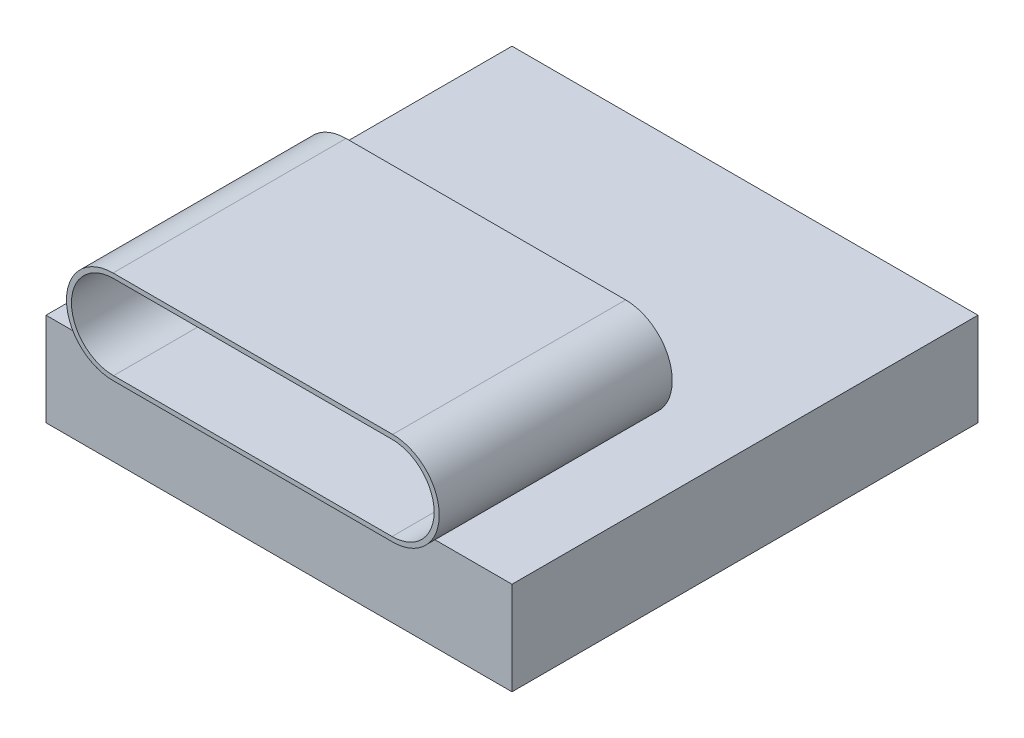
ISO-10303-21;
HEADER;
FILE_DESCRIPTION(('STEP AP214'),'2;1');
FILE_NAME('part.step','',(''),(''),'','','');
FILE_SCHEMA(('AUTOMOTIVE_DESIGN { 1 0 10303 214 1 1 1 1 }'));
ENDSEC;
DATA;
#1=APPLICATION_CONTEXT('core data for automotive mechanical design processes');
#2=APPLICATION_PROTOCOL_DEFINITION('international standard','automotive_design',2000,#1);
#3=PRODUCT_CONTEXT('',#1,'mechanical');
#4=PRODUCT('Part','Part','',(#3));
#5=PRODUCT_RELATED_PRODUCT_CATEGORY('part','',(#4));
#6=PRODUCT_DEFINITION_FORMATION('','',#4);
#7=PRODUCT_DEFINITION_CONTEXT('part definition',#1,'design');
#8=PRODUCT_DEFINITION('design','',#6,#7);
#9=PRODUCT_DEFINITION_SHAPE('','',#8);
#10=(LENGTH_UNIT() NAMED_UNIT(*) SI_UNIT(.MILLI.,.METRE.));
#11=(NAMED_UNIT(*) PLANE_ANGLE_UNIT() SI_UNIT($,.RADIAN.));
#12=(NAMED_UNIT(*) SI_UNIT($,.STERADIAN.) SOLID_ANGLE_UNIT());
#13=UNCERTAINTY_MEASURE_WITH_UNIT(LENGTH_MEASURE(1.E-05),#10,'distance_accuracy_value','');
#14=(GEOMETRIC_REPRESENTATION_CONTEXT(3) GLOBAL_UNCERTAINTY_ASSIGNED_CONTEXT((#13)) GLOBAL_UNIT_ASSIGNED_CONTEXT((#10,
#11,#12)) REPRESENTATION_CONTEXT('',''));
#15=CARTESIAN_POINT('',(0.,0.,0.));
#16=DIRECTION('',(0.,0.,1.));
#17=DIRECTION('',(1.,0.,0.));
#18=AXIS2_PLACEMENT_3D('',#15,#16,#17);
#19=CARTESIAN_POINT('',(-3.06110867908621,4.00403716134053,5.));
#20=DIRECTION('',(0.,1.,0.));
#21=DIRECTION('',(0.,0.,1.));
#22=AXIS2_PLACEMENT_3D('',#19,#20,#21);
#23=PLANE('',#22);
#24=DIRECTION('',(1.,0.,0.));
#25=VECTOR('',#24,1.);
#26=CARTESIAN_POINT('',(-3.06110867908621,4.00403716134053,0.));
#27=LINE('',#26,#25);
#28=CARTESIAN_POINT('',(-3.06110867908621,4.00403716134053,0.));
#29=VERTEX_POINT('',#28);
#30=CARTESIAN_POINT('',(2.93889132091379,4.00403716134053,0.));
#31=VERTEX_POINT('',#30);
#32=EDGE_CURVE('E139',#29,#31,#27,.T.);
#33=ORIENTED_EDGE('',*,*,#32,.F.);
#34=DIRECTION('',(0.,0.,-1.));
#35=VECTOR('',#34,1.);
#36=CARTESIAN_POINT('',(-3.06110867908621,4.00403716134053,5.));
#37=LINE('',#36,#35);
#38=CARTESIAN_POINT('',(-3.06110867908621,4.00403716134053,5.));
#39=VERTEX_POINT('',#38);
#40=EDGE_CURVE('E161',#39,#29,#37,.T.);
#41=ORIENTED_EDGE('',*,*,#40,.F.);
#42=DIRECTION('',(1.,0.,0.));
#43=VECTOR('',#42,1.);
#44=CARTESIAN_POINT('',(-3.06110867908621,4.00403716134053,5.));
#45=LINE('',#44,#43);
#46=CARTESIAN_POINT('',(2.93889132091379,4.00403716134053,5.));
#47=VERTEX_POINT('',#46);
#48=EDGE_CURVE('E142',#39,#47,#45,.T.);
#49=ORIENTED_EDGE('',*,*,#48,.T.);
#50=DIRECTION('',(0.,0.,-1.));
#51=VECTOR('',#50,1.);
#52=CARTESIAN_POINT('',(2.93889132091379,4.00403716134053,5.));
#53=LINE('',#52,#51);
#54=EDGE_CURVE('E152',#47,#31,#53,.T.);
#55=ORIENTED_EDGE('',*,*,#54,.T.);
#56=EDGE_LOOP('',(#33,#41,#49,#55));
#57=FACE_BOUND('',#56,.T.);
#58=ADVANCED_FACE('F49',(#57),#23,.T.);
#59=CARTESIAN_POINT('',(-3.06110867908621,3.00403716134053,5.));
#60=DIRECTION('',(0.,0.,-1.));
#61=DIRECTION('',(-1.,0.,0.));
#62=AXIS2_PLACEMENT_3D('',#59,#60,#61);
#63=CYLINDRICAL_SURFACE('',#62,1.);
#64=CARTESIAN_POINT('',(-3.06110867908621,3.00403716134053,0.));
#65=DIRECTION('',(0.,0.,1.));
#66=DIRECTION('',(1.,0.,0.));
#67=AXIS2_PLACEMENT_3D('',#64,#65,#66);
#68=CIRCLE('',#67,1.);
#69=CARTESIAN_POINT('',(-3.06110867908621,2.00403716134053,0.));
#70=VERTEX_POINT('',#69);
#71=EDGE_CURVE('E146',#29,#70,#68,.T.);
#72=ORIENTED_EDGE('',*,*,#71,.T.);
#73=DIRECTION('',(0.,0.,-1.));
#74=VECTOR('',#73,1.);
#75=CARTESIAN_POINT('',(-3.06110867908621,2.00403716134053,5.));
#76=LINE('',#75,#74);
#77=CARTESIAN_POINT('',(-3.06110867908621,2.00403716134053,5.));
#78=VERTEX_POINT('',#77);
#79=EDGE_CURVE('E164',#78,#70,#76,.T.);
#80=ORIENTED_EDGE('',*,*,#79,.F.);
#81=CARTESIAN_POINT('',(-3.06110867908621,3.00403716134053,5.));
#82=DIRECTION('',(0.,0.,1.));
#83=DIRECTION('',(1.,0.,0.));
#84=AXIS2_PLACEMENT_3D('',#81,#82,#83);
#85=CIRCLE('',#84,1.);
#86=EDGE_CURVE('E150',#39,#78,#85,.T.);
#87=ORIENTED_EDGE('',*,*,#86,.F.);
#88=ORIENTED_EDGE('',*,*,#40,.T.);
#89=EDGE_LOOP('',(#72,#80,#87,#88));
#90=FACE_BOUND('',#89,.T.);
#91=ADVANCED_FACE('F191',(#90),#63,.T.);
#92=CARTESIAN_POINT('',(-3.06110867908621,2.00403716134053,5.));
#93=DIRECTION('',(0.,1.,0.));
#94=DIRECTION('',(0.,0.,1.));
#95=AXIS2_PLACEMENT_3D('',#92,#93,#94);
#96=PLANE('',#95);
#97=DIRECTION('',(1.,0.,0.));
#98=VECTOR('',#97,1.);
#99=CARTESIAN_POINT('',(-3.06110867908621,2.00403716134053,0.));
#100=LINE('',#99,#98);
#101=CARTESIAN_POINT('',(2.93889132091379,2.00403716134053,0.));
#102=VERTEX_POINT('',#101);
#103=EDGE_CURVE('E158',#70,#102,#100,.T.);
#104=ORIENTED_EDGE('',*,*,#103,.T.);
#105=DIRECTION('',(0.,0.,-1.));
#106=VECTOR('',#105,1.);
#107=CARTESIAN_POINT('',(2.93889132091379,2.00403716134053,5.));
#108=LINE('',#107,#106);
#109=CARTESIAN_POINT('',(2.93889132091379,2.00403716134053,5.));
#110=VERTEX_POINT('',#109);
#111=EDGE_CURVE('E167',#110,#102,#108,.T.);
#112=ORIENTED_EDGE('',*,*,#111,.F.);
#113=DIRECTION('',(1.,0.,0.));
#114=VECTOR('',#113,1.);
#115=CARTESIAN_POINT('',(-3.06110867908621,2.00403716134053,5.));
#116=LINE('',#115,#114);
#117=EDGE_CURVE('E148',#78,#110,#116,.T.);
#118=ORIENTED_EDGE('',*,*,#117,.F.);
#119=ORIENTED_EDGE('',*,*,#79,.T.);
#120=EDGE_LOOP('',(#104,#112,#118,#119));
#121=FACE_BOUND('',#120,.T.);
#122=ADVANCED_FACE('F196',(#121),#96,.F.);
#123=CARTESIAN_POINT('',(2.93889132091379,3.00403716134053,5.));
#124=DIRECTION('',(0.,0.,-1.));
#125=DIRECTION('',(-1.,0.,0.));
#126=AXIS2_PLACEMENT_3D('',#123,#124,#125);
#127=CYLINDRICAL_SURFACE('',#126,1.);
#128=CARTESIAN_POINT('',(2.93889132091379,3.00403716134053,0.));
#129=DIRECTION('',(0.,0.,1.));
#130=DIRECTION('',(1.,0.,0.));
#131=AXIS2_PLACEMENT_3D('',#128,#129,#130);
#132=CIRCLE('',#131,1.);
#133=EDGE_CURVE('E155',#102,#31,#132,.T.);
#134=ORIENTED_EDGE('',*,*,#133,.T.);
#135=ORIENTED_EDGE('',*,*,#54,.F.);
#136=CARTESIAN_POINT('',(2.93889132091379,3.00403716134053,5.));
#137=DIRECTION('',(0.,0.,1.));
#138=DIRECTION('',(1.,0.,0.));
#139=AXIS2_PLACEMENT_3D('',#136,#137,#138);
#140=CIRCLE('',#139,1.);
#141=EDGE_CURVE('E145',#110,#47,#140,.T.);
#142=ORIENTED_EDGE('',*,*,#141,.F.);
#143=ORIENTED_EDGE('',*,*,#111,.T.);
#144=EDGE_LOOP('',(#134,#135,#142,#143));
#145=FACE_BOUND('',#144,.T.);
#146=ADVANCED_FACE('F212',(#145),#127,.T.);
#147=CARTESIAN_POINT('',(2.93889132091379,3.00403716134053,5.));
#148=DIRECTION('',(0.,0.,1.));
#149=DIRECTION('',(1.,0.,0.));
#150=AXIS2_PLACEMENT_3D('',#147,#148,#149);
#151=PLANE('',#150);
#152=CARTESIAN_POINT('',(-3.05073203949609,3.00336430111715,5.));
#153=DIRECTION('',(0.,0.,1.));
#154=DIRECTION('',(1.,0.,0.));
#155=AXIS2_PLACEMENT_3D('',#152,#153,#154);
#156=CIRCLE('',#155,0.902767644340679);
#157=CARTESIAN_POINT('',(-3.05073203949609,3.90613194545782,5.));
#158=VERTEX_POINT('',#157);
#159=CARTESIAN_POINT('',(-3.05073203949609,2.10059665677647,5.));
#160=VERTEX_POINT('',#159);
#161=EDGE_CURVE('E63',#158,#160,#156,.T.);
#162=ORIENTED_EDGE('',*,*,#161,.F.);
#163=DIRECTION('',(-1.,0.,0.));
#164=VECTOR('',#163,1.);
#165=CARTESIAN_POINT('',(-3.05073203949609,3.90613194545782,5.));
#166=LINE('',#165,#164);
#167=CARTESIAN_POINT('',(2.92621236441461,3.90613194545782,5.));
#168=VERTEX_POINT('',#167);
#169=EDGE_CURVE('E132',#168,#158,#166,.T.);
#170=ORIENTED_EDGE('',*,*,#169,.F.);
#171=CARTESIAN_POINT('',(2.92621236441461,3.00336430111715,5.));
#172=DIRECTION('',(0.,0.,1.));
#173=DIRECTION('',(1.,0.,0.));
#174=AXIS2_PLACEMENT_3D('',#171,#172,#173);
#175=CIRCLE('',#174,0.902767644340679);
#176=CARTESIAN_POINT('',(2.92621236441461,2.10059665677647,5.));
#177=VERTEX_POINT('',#176);
#178=EDGE_CURVE('E116',#177,#168,#175,.T.);
#179=ORIENTED_EDGE('',*,*,#178,.F.);
#180=DIRECTION('',(1.,0.,0.));
#181=VECTOR('',#180,1.);
#182=CARTESIAN_POINT('',(-3.05073203949609,2.10059665677647,5.));
#183=LINE('',#182,#181);
#184=EDGE_CURVE('E125',#160,#177,#183,.T.);
#185=ORIENTED_EDGE('',*,*,#184,.F.);
#186=EDGE_LOOP('',(#162,#170,#179,#185));
#187=FACE_BOUND('',#186,.T.);
#188=ORIENTED_EDGE('',*,*,#48,.F.);
#189=ORIENTED_EDGE('',*,*,#86,.T.);
#190=ORIENTED_EDGE('',*,*,#117,.T.);
#191=ORIENTED_EDGE('',*,*,#141,.T.);
#192=EDGE_LOOP('',(#188,#189,#190,#191));
#193=FACE_BOUND('',#192,.T.);
#194=ADVANCED_FACE('F129',(#187,#193),#151,.T.);
#195=CARTESIAN_POINT('',(2.93889132091379,3.00403716134053,0.));
#196=DIRECTION('',(0.,0.,1.));
#197=DIRECTION('',(1.,0.,0.));
#198=AXIS2_PLACEMENT_3D('',#195,#196,#197);
#199=PLANE('',#198);
#200=DIRECTION('',(-1.,0.,0.));
#201=VECTOR('',#200,1.);
#202=CARTESIAN_POINT('',(2.93889132091379,3.90613194545782,0.));
#203=LINE('',#202,#201);
#204=CARTESIAN_POINT('',(2.92621236441461,3.90613194545782,0.));
#205=VERTEX_POINT('',#204);
#206=CARTESIAN_POINT('',(-3.05073203949609,3.90613194545782,0.));
#207=VERTEX_POINT('',#206);
#208=EDGE_CURVE('E56',#205,#207,#203,.T.);
#209=ORIENTED_EDGE('',*,*,#208,.T.);
#210=CARTESIAN_POINT('',(-3.05073203949609,3.00336430111715,0.));
#211=DIRECTION('',(0.,0.,1.));
#212=DIRECTION('',(1.,0.,0.));
#213=AXIS2_PLACEMENT_3D('',#210,#211,#212);
#214=CIRCLE('',#213,0.902767644340679);
#215=CARTESIAN_POINT('',(-3.05073203949609,2.10059665677647,0.));
#216=VERTEX_POINT('',#215);
#217=EDGE_CURVE('E12',#207,#216,#214,.T.);
#218=ORIENTED_EDGE('',*,*,#217,.T.);
#219=DIRECTION('',(1.,0.,0.));
#220=VECTOR('',#219,1.);
#221=CARTESIAN_POINT('',(2.93889132091379,2.10059665677647,0.));
#222=LINE('',#221,#220);
#223=CARTESIAN_POINT('',(2.92621236441461,2.10059665677647,0.));
#224=VERTEX_POINT('',#223);
#225=EDGE_CURVE('E163',#216,#224,#222,.T.);
#226=ORIENTED_EDGE('',*,*,#225,.T.);
#227=CARTESIAN_POINT('',(2.92621236441461,3.00336430111715,0.));
#228=DIRECTION('',(0.,0.,1.));
#229=DIRECTION('',(1.,0.,0.));
#230=AXIS2_PLACEMENT_3D('',#227,#228,#229);
#231=CIRCLE('',#230,0.902767644340679);
#232=EDGE_CURVE('E119',#224,#205,#231,.T.);
#233=ORIENTED_EDGE('',*,*,#232,.T.);
#234=EDGE_LOOP('',(#209,#218,#226,#233));
#235=FACE_BOUND('',#234,.T.);
#236=ORIENTED_EDGE('',*,*,#32,.T.);
#237=ORIENTED_EDGE('',*,*,#133,.F.);
#238=ORIENTED_EDGE('',*,*,#103,.F.);
#239=ORIENTED_EDGE('',*,*,#71,.F.);
#240=EDGE_LOOP('',(#236,#237,#238,#239));
#241=FACE_BOUND('',#240,.T.);
#242=ADVANCED_FACE('F174',(#235,#241),#199,.F.);
#243=CARTESIAN_POINT('',(-3.05073203949609,3.00336430111715,-6.5));
#244=DIRECTION('',(0.,0.,1.));
#245=DIRECTION('',(1.,0.,0.));
#246=AXIS2_PLACEMENT_3D('',#243,#244,#245);
#247=CYLINDRICAL_SURFACE('',#246,0.902767644340679);
#248=DIRECTION('',(0.,0.,1.));
#249=VECTOR('',#248,1.);
#250=CARTESIAN_POINT('',(-3.05073203949609,3.90613194545782,-6.5));
#251=LINE('',#250,#249);
#252=EDGE_CURVE('E137',#207,#158,#251,.T.);
#253=ORIENTED_EDGE('',*,*,#252,.T.);
#254=ORIENTED_EDGE('',*,*,#161,.T.);
#255=DIRECTION('',(0.,0.,1.));
#256=VECTOR('',#255,1.);
#257=CARTESIAN_POINT('',(-3.05073203949609,2.10059665677647,-6.5));
#258=LINE('',#257,#256);
#259=EDGE_CURVE('E122',#216,#160,#258,.T.);
#260=ORIENTED_EDGE('',*,*,#259,.F.);
#261=ORIENTED_EDGE('',*,*,#217,.F.);
#262=EDGE_LOOP('',(#253,#254,#260,#261));
#263=FACE_BOUND('',#262,.T.);
#264=ADVANCED_FACE('F179',(#263),#247,.F.);
#265=CARTESIAN_POINT('',(-3.05073203949609,3.90613194545782,-6.5));
#266=DIRECTION('',(0.,1.,0.));
#267=DIRECTION('',(0.,0.,1.));
#268=AXIS2_PLACEMENT_3D('',#265,#266,#267);
#269=PLANE('',#268);
#270=DIRECTION('',(0.,0.,1.));
#271=VECTOR('',#270,1.);
#272=CARTESIAN_POINT('',(2.92621236441461,3.90613194545782,-6.5));
#273=LINE('',#272,#271);
#274=EDGE_CURVE('E121',#205,#168,#273,.T.);
#275=ORIENTED_EDGE('',*,*,#274,.T.);
#276=ORIENTED_EDGE('',*,*,#169,.T.);
#277=ORIENTED_EDGE('',*,*,#252,.F.);
#278=ORIENTED_EDGE('',*,*,#208,.F.);
#279=EDGE_LOOP('',(#275,#276,#277,#278));
#280=FACE_BOUND('',#279,.T.);
#281=ADVANCED_FACE('F178',(#280),#269,.F.);
#282=CARTESIAN_POINT('',(2.92621236441461,3.00336430111715,-6.5));
#283=DIRECTION('',(0.,0.,1.));
#284=DIRECTION('',(1.,0.,0.));
#285=AXIS2_PLACEMENT_3D('',#282,#283,#284);
#286=CYLINDRICAL_SURFACE('',#285,0.902767644340679);
#287=DIRECTION('',(0.,0.,1.));
#288=VECTOR('',#287,1.);
#289=CARTESIAN_POINT('',(2.92621236441461,2.10059665677647,-6.5));
#290=LINE('',#289,#288);
#291=EDGE_CURVE('E71',#224,#177,#290,.T.);
#292=ORIENTED_EDGE('',*,*,#291,.T.);
#293=ORIENTED_EDGE('',*,*,#178,.T.);
#294=ORIENTED_EDGE('',*,*,#274,.F.);
#295=ORIENTED_EDGE('',*,*,#232,.F.);
#296=EDGE_LOOP('',(#292,#293,#294,#295));
#297=FACE_BOUND('',#296,.T.);
#298=ADVANCED_FACE('F113',(#297),#286,.F.);
#299=CARTESIAN_POINT('',(-3.05073203949609,2.10059665677647,-6.5));
#300=DIRECTION('',(0.,-1.,0.));
#301=DIRECTION('',(0.,0.,-1.));
#302=AXIS2_PLACEMENT_3D('',#299,#300,#301);
#303=PLANE('',#302);
#304=ORIENTED_EDGE('',*,*,#259,.T.);
#305=ORIENTED_EDGE('',*,*,#184,.T.);
#306=ORIENTED_EDGE('',*,*,#291,.F.);
#307=ORIENTED_EDGE('',*,*,#225,.F.);
#308=EDGE_LOOP('',(#304,#305,#306,#307));
#309=FACE_BOUND('',#308,.T.);
#310=ADVANCED_FACE('F126',(#309),#303,.F.);
#311=CLOSED_SHELL('',(#58,#91,#122,#146,#194,#242,#264,#281,#298,#310));
#312=MANIFOLD_SOLID_BREP('B2',#311);
#313=CARTESIAN_POINT('',(5.,2.,-6.5));
#314=DIRECTION('',(-1.,0.,0.));
#315=DIRECTION('',(0.,0.,1.));
#316=AXIS2_PLACEMENT_3D('',#313,#314,#315);
#317=PLANE('',#316);
#318=DIRECTION('',(0.,0.,-1.));
#319=VECTOR('',#318,1.);
#320=CARTESIAN_POINT('',(5.,0.,-6.5));
#321=LINE('',#320,#319);
#322=CARTESIAN_POINT('',(5.,0.,4.5));
#323=VERTEX_POINT('',#322);
#324=CARTESIAN_POINT('',(5.,0.,-5.5));
#325=VERTEX_POINT('',#324);
#326=EDGE_CURVE('E355',#323,#325,#321,.T.);
#327=ORIENTED_EDGE('',*,*,#326,.T.);
#328=DIRECTION('',(0.,-1.,0.));
#329=VECTOR('',#328,1.);
#330=CARTESIAN_POINT('',(5.,2.,-5.5));
#331=LINE('',#330,#329);
#332=CARTESIAN_POINT('',(5.,2.,-5.5));
#333=VERTEX_POINT('',#332);
#334=EDGE_CURVE('E330',#333,#325,#331,.T.);
#335=ORIENTED_EDGE('',*,*,#334,.F.);
#336=DIRECTION('',(0.,0.,-1.));
#337=VECTOR('',#336,1.);
#338=CARTESIAN_POINT('',(5.,2.,-6.5));
#339=LINE('',#338,#337);
#340=CARTESIAN_POINT('',(5.,2.,4.5));
#341=VERTEX_POINT('',#340);
#342=EDGE_CURVE('E288',#341,#333,#339,.T.);
#343=ORIENTED_EDGE('',*,*,#342,.F.);
#344=DIRECTION('',(0.,-1.,0.));
#345=VECTOR('',#344,1.);
#346=CARTESIAN_POINT('',(5.,2.,4.5));
#347=LINE('',#346,#345);
#348=EDGE_CURVE('E348',#341,#323,#347,.T.);
#349=ORIENTED_EDGE('',*,*,#348,.T.);
#350=EDGE_LOOP('',(#327,#335,#343,#349));
#351=FACE_BOUND('',#350,.T.);
#352=ADVANCED_FACE('F279',(#351),#317,.F.);
#353=CARTESIAN_POINT('',(-5.,2.,-6.5));
#354=DIRECTION('',(1.,0.,0.));
#355=DIRECTION('',(0.,0.,-1.));
#356=AXIS2_PLACEMENT_3D('',#353,#354,#355);
#357=PLANE('',#356);
#358=DIRECTION('',(0.,0.,1.));
#359=VECTOR('',#358,1.);
#360=CARTESIAN_POINT('',(-5.,2.,-6.5));
#361=LINE('',#360,#359);
#362=CARTESIAN_POINT('',(-5.,2.,-5.5));
#363=VERTEX_POINT('',#362);
#364=CARTESIAN_POINT('',(-5.,2.,4.5));
#365=VERTEX_POINT('',#364);
#366=EDGE_CURVE('E47',#363,#365,#361,.T.);
#367=ORIENTED_EDGE('',*,*,#366,.F.);
#368=DIRECTION('',(0.,1.,0.));
#369=VECTOR('',#368,1.);
#370=CARTESIAN_POINT('',(-5.,2.,-5.5));
#371=LINE('',#370,#369);
#372=CARTESIAN_POINT('',(-5.,0.,-5.5));
#373=VERTEX_POINT('',#372);
#374=EDGE_CURVE('E320',#373,#363,#371,.T.);
#375=ORIENTED_EDGE('',*,*,#374,.F.);
#376=DIRECTION('',(0.,0.,1.));
#377=VECTOR('',#376,1.);
#378=CARTESIAN_POINT('',(-5.,0.,-6.5));
#379=LINE('',#378,#377);
#380=CARTESIAN_POINT('',(-5.,0.,4.5));
#381=VERTEX_POINT('',#380);
#382=EDGE_CURVE('E282',#373,#381,#379,.T.);
#383=ORIENTED_EDGE('',*,*,#382,.T.);
#384=DIRECTION('',(0.,-1.,0.));
#385=VECTOR('',#384,1.);
#386=CARTESIAN_POINT('',(-5.,2.,4.5));
#387=LINE('',#386,#385);
#388=EDGE_CURVE('E321',#365,#381,#387,.T.);
#389=ORIENTED_EDGE('',*,*,#388,.F.);
#390=EDGE_LOOP('',(#367,#375,#383,#389));
#391=FACE_BOUND('',#390,.T.);
#392=ADVANCED_FACE('F318',(#391),#357,.F.);
#393=CARTESIAN_POINT('',(0.,2.,0.));
#394=DIRECTION('',(0.,1.,0.));
#395=DIRECTION('',(0.,0.,1.));
#396=AXIS2_PLACEMENT_3D('',#393,#394,#395);
#397=PLANE('',#396);
#398=ORIENTED_EDGE('',*,*,#342,.T.);
#399=DIRECTION('',(1.,0.,0.));
#400=VECTOR('',#399,1.);
#401=CARTESIAN_POINT('',(5.,2.,-5.5));
#402=LINE('',#401,#400);
#403=EDGE_CURVE('E323',#363,#333,#402,.T.);
#404=ORIENTED_EDGE('',*,*,#403,.F.);
#405=ORIENTED_EDGE('',*,*,#366,.T.);
#406=DIRECTION('',(1.,0.,0.));
#407=VECTOR('',#406,1.);
#408=CARTESIAN_POINT('',(-5.,2.,4.5));
#409=LINE('',#408,#407);
#410=EDGE_CURVE('E352',#365,#341,#409,.T.);
#411=ORIENTED_EDGE('',*,*,#410,.T.);
#412=EDGE_LOOP('',(#398,#404,#405,#411));
#413=FACE_BOUND('',#412,.T.);
#414=ADVANCED_FACE('F324',(#413),#397,.T.);
#415=CARTESIAN_POINT('',(0.,0.,0.));
#416=DIRECTION('',(0.,1.,0.));
#417=DIRECTION('',(0.,0.,1.));
#418=AXIS2_PLACEMENT_3D('',#415,#416,#417);
#419=PLANE('',#418);
#420=ORIENTED_EDGE('',*,*,#382,.F.);
#421=DIRECTION('',(-1.,0.,0.));
#422=VECTOR('',#421,1.);
#423=CARTESIAN_POINT('',(5.,0.,-5.5));
#424=LINE('',#423,#422);
#425=EDGE_CURVE('E335',#325,#373,#424,.T.);
#426=ORIENTED_EDGE('',*,*,#425,.F.);
#427=ORIENTED_EDGE('',*,*,#326,.F.);
#428=DIRECTION('',(1.,0.,0.));
#429=VECTOR('',#428,1.);
#430=CARTESIAN_POINT('',(-5.,0.,4.5));
#431=LINE('',#430,#429);
#432=EDGE_CURVE('E345',#381,#323,#431,.T.);
#433=ORIENTED_EDGE('',*,*,#432,.F.);
#434=EDGE_LOOP('',(#420,#426,#427,#433));
#435=FACE_BOUND('',#434,.T.);
#436=ADVANCED_FACE('F363',(#435),#419,.F.);
#437=CARTESIAN_POINT('',(0.,0.,4.5));
#438=DIRECTION('',(0.,0.,1.));
#439=DIRECTION('',(1.,0.,0.));
#440=AXIS2_PLACEMENT_3D('',#437,#438,#439);
#441=PLANE('',#440);
#442=ORIENTED_EDGE('',*,*,#388,.T.);
#443=ORIENTED_EDGE('',*,*,#432,.T.);
#444=ORIENTED_EDGE('',*,*,#348,.F.);
#445=ORIENTED_EDGE('',*,*,#410,.F.);
#446=EDGE_LOOP('',(#442,#443,#444,#445));
#447=FACE_BOUND('',#446,.T.);
#448=ADVANCED_FACE('F365',(#447),#441,.T.);
#449=CARTESIAN_POINT('',(0.,0.,-5.5));
#450=DIRECTION('',(0.,0.,-1.));
#451=DIRECTION('',(-1.,0.,0.));
#452=AXIS2_PLACEMENT_3D('',#449,#450,#451);
#453=PLANE('',#452);
#454=ORIENTED_EDGE('',*,*,#374,.T.);
#455=ORIENTED_EDGE('',*,*,#403,.T.);
#456=ORIENTED_EDGE('',*,*,#334,.T.);
#457=ORIENTED_EDGE('',*,*,#425,.T.);
#458=EDGE_LOOP('',(#454,#455,#456,#457));
#459=FACE_BOUND('',#458,.T.);
#460=ADVANCED_FACE('F333',(#459),#453,.T.);
#461=CLOSED_SHELL('',(#352,#392,#414,#436,#448,#460));
#462=MANIFOLD_SOLID_BREP('B6',#461);
#463=ADVANCED_BREP_SHAPE_REPRESENTATION('',(#18,#312,#462),#14);
#464=SHAPE_DEFINITION_REPRESENTATION(#9,#463);
ENDSEC;
END-ISO-10303-21;
